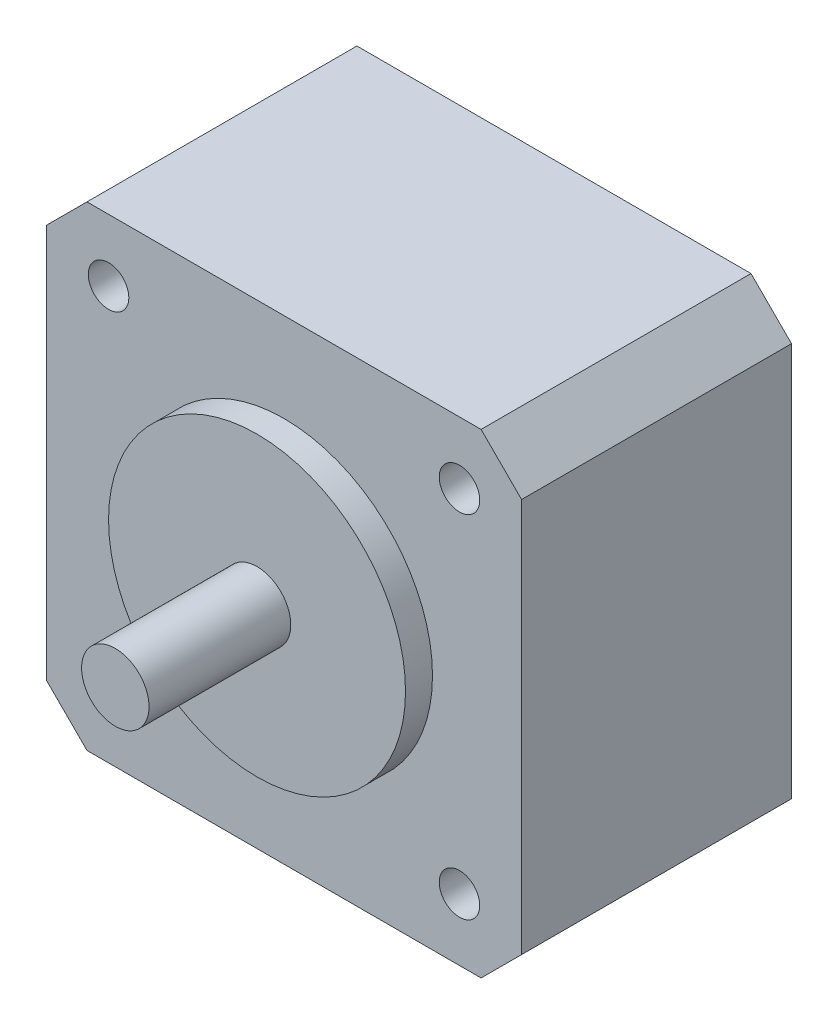
ISO-10303-21;
HEADER;
FILE_DESCRIPTION(('STEP AP214'),'2;1');
FILE_NAME('part.step','',(''),(''),'','','');
FILE_SCHEMA(('AUTOMOTIVE_DESIGN { 1 0 10303 214 1 1 1 1 }'));
ENDSEC;
DATA;
#1=APPLICATION_CONTEXT('core data for automotive mechanical design processes');
#2=APPLICATION_PROTOCOL_DEFINITION('international standard','automotive_design',2000,#1);
#3=PRODUCT_CONTEXT('',#1,'mechanical');
#4=PRODUCT('Part','Part','',(#3));
#5=PRODUCT_RELATED_PRODUCT_CATEGORY('part','',(#4));
#6=PRODUCT_DEFINITION_FORMATION('','',#4);
#7=PRODUCT_DEFINITION_CONTEXT('part definition',#1,'design');
#8=PRODUCT_DEFINITION('design','',#6,#7);
#9=PRODUCT_DEFINITION_SHAPE('','',#8);
#10=(LENGTH_UNIT() NAMED_UNIT(*) SI_UNIT(.MILLI.,.METRE.));
#11=(NAMED_UNIT(*) PLANE_ANGLE_UNIT() SI_UNIT($,.RADIAN.));
#12=(NAMED_UNIT(*) SI_UNIT($,.STERADIAN.) SOLID_ANGLE_UNIT());
#13=UNCERTAINTY_MEASURE_WITH_UNIT(LENGTH_MEASURE(1.E-05),#10,'distance_accuracy_value','');
#14=(GEOMETRIC_REPRESENTATION_CONTEXT(3) GLOBAL_UNCERTAINTY_ASSIGNED_CONTEXT((#13)) GLOBAL_UNIT_ASSIGNED_CONTEXT((#10,
#11,#12)) REPRESENTATION_CONTEXT('',''));
#15=CARTESIAN_POINT('',(0.,0.,0.));
#16=DIRECTION('',(0.,0.,1.));
#17=DIRECTION('',(1.,0.,0.));
#18=AXIS2_PLACEMENT_3D('',#15,#16,#17);
#19=CARTESIAN_POINT('',(17.6,17.6,20.));
#20=DIRECTION('',(-1.,0.,0.));
#21=DIRECTION('',(0.,0.,1.));
#22=AXIS2_PLACEMENT_3D('',#19,#20,#21);
#23=PLANE('',#22);
#24=DIRECTION('',(0.,1.,0.));
#25=VECTOR('',#24,1.);
#26=CARTESIAN_POINT('',(17.6,17.6,20.));
#27=LINE('',#26,#25);
#28=CARTESIAN_POINT('',(17.6,-14.6,20.));
#29=VERTEX_POINT('',#28);
#30=CARTESIAN_POINT('',(17.6,14.6,20.));
#31=VERTEX_POINT('',#30);
#32=EDGE_CURVE('E127',#29,#31,#27,.T.);
#33=ORIENTED_EDGE('',*,*,#32,.F.);
#34=DIRECTION('',(0.,0.,-1.));
#35=VECTOR('',#34,1.);
#36=CARTESIAN_POINT('',(17.6,-14.6,20.));
#37=LINE('',#36,#35);
#38=CARTESIAN_POINT('',(17.6,-14.6,0.));
#39=VERTEX_POINT('',#38);
#40=EDGE_CURVE('E11',#29,#39,#37,.T.);
#41=ORIENTED_EDGE('',*,*,#40,.T.);
#42=DIRECTION('',(0.,1.,0.));
#43=VECTOR('',#42,1.);
#44=CARTESIAN_POINT('',(17.6,17.6,0.));
#45=LINE('',#44,#43);
#46=CARTESIAN_POINT('',(17.6,14.6,0.));
#47=VERTEX_POINT('',#46);
#48=EDGE_CURVE('E159',#39,#47,#45,.T.);
#49=ORIENTED_EDGE('',*,*,#48,.T.);
#50=DIRECTION('',(0.,0.,1.));
#51=VECTOR('',#50,1.);
#52=CARTESIAN_POINT('',(17.6,14.6,20.));
#53=LINE('',#52,#51);
#54=EDGE_CURVE('E41',#47,#31,#53,.T.);
#55=ORIENTED_EDGE('',*,*,#54,.T.);
#56=EDGE_LOOP('',(#33,#41,#49,#55));
#57=FACE_BOUND('',#56,.T.);
#58=ADVANCED_FACE('F33',(#57),#23,.F.);
#59=CARTESIAN_POINT('',(-17.6,17.6,20.));
#60=DIRECTION('',(0.,-1.,0.));
#61=DIRECTION('',(0.,0.,-1.));
#62=AXIS2_PLACEMENT_3D('',#59,#60,#61);
#63=PLANE('',#62);
#64=DIRECTION('',(-1.,0.,0.));
#65=VECTOR('',#64,1.);
#66=CARTESIAN_POINT('',(-17.6,17.6,0.));
#67=LINE('',#66,#65);
#68=CARTESIAN_POINT('',(14.6,17.6,0.));
#69=VERTEX_POINT('',#68);
#70=CARTESIAN_POINT('',(-14.6,17.6,0.));
#71=VERTEX_POINT('',#70);
#72=EDGE_CURVE('E132',#69,#71,#67,.T.);
#73=ORIENTED_EDGE('',*,*,#72,.T.);
#74=DIRECTION('',(0.,0.,1.));
#75=VECTOR('',#74,1.);
#76=CARTESIAN_POINT('',(-14.6,17.6,20.));
#77=LINE('',#76,#75);
#78=CARTESIAN_POINT('',(-14.6,17.6,20.));
#79=VERTEX_POINT('',#78);
#80=EDGE_CURVE('E48',#71,#79,#77,.T.);
#81=ORIENTED_EDGE('',*,*,#80,.T.);
#82=DIRECTION('',(-1.,0.,0.));
#83=VECTOR('',#82,1.);
#84=CARTESIAN_POINT('',(-17.6,17.6,20.));
#85=LINE('',#84,#83);
#86=CARTESIAN_POINT('',(14.6,17.6,20.));
#87=VERTEX_POINT('',#86);
#88=EDGE_CURVE('E130',#87,#79,#85,.T.);
#89=ORIENTED_EDGE('',*,*,#88,.F.);
#90=DIRECTION('',(0.,0.,-1.));
#91=VECTOR('',#90,1.);
#92=CARTESIAN_POINT('',(14.6,17.6,20.));
#93=LINE('',#92,#91);
#94=EDGE_CURVE('E151',#87,#69,#93,.T.);
#95=ORIENTED_EDGE('',*,*,#94,.T.);
#96=EDGE_LOOP('',(#73,#81,#89,#95));
#97=FACE_BOUND('',#96,.T.);
#98=ADVANCED_FACE('F166',(#97),#63,.F.);
#99=CARTESIAN_POINT('',(-17.6,17.6,20.));
#100=DIRECTION('',(1.,0.,0.));
#101=DIRECTION('',(0.,1.,0.));
#102=AXIS2_PLACEMENT_3D('',#99,#100,#101);
#103=PLANE('',#102);
#104=DIRECTION('',(0.,-1.,0.));
#105=VECTOR('',#104,1.);
#106=CARTESIAN_POINT('',(-17.6,17.6,0.));
#107=LINE('',#106,#105);
#108=CARTESIAN_POINT('',(-17.6,14.6,0.));
#109=VERTEX_POINT('',#108);
#110=CARTESIAN_POINT('',(-17.6,-14.6,0.));
#111=VERTEX_POINT('',#110);
#112=EDGE_CURVE('E128',#109,#111,#107,.T.);
#113=ORIENTED_EDGE('',*,*,#112,.T.);
#114=DIRECTION('',(0.,0.,1.));
#115=VECTOR('',#114,1.);
#116=CARTESIAN_POINT('',(-17.6,-14.6,20.));
#117=LINE('',#116,#115);
#118=CARTESIAN_POINT('',(-17.6,-14.6,20.));
#119=VERTEX_POINT('',#118);
#120=EDGE_CURVE('E105',#111,#119,#117,.T.);
#121=ORIENTED_EDGE('',*,*,#120,.T.);
#122=DIRECTION('',(0.,-1.,0.));
#123=VECTOR('',#122,1.);
#124=CARTESIAN_POINT('',(-17.6,17.6,20.));
#125=LINE('',#124,#123);
#126=CARTESIAN_POINT('',(-17.6,14.6,20.));
#127=VERTEX_POINT('',#126);
#128=EDGE_CURVE('E172',#127,#119,#125,.T.);
#129=ORIENTED_EDGE('',*,*,#128,.F.);
#130=DIRECTION('',(0.,0.,-1.));
#131=VECTOR('',#130,1.);
#132=CARTESIAN_POINT('',(-17.6,14.6,20.));
#133=LINE('',#132,#131);
#134=EDGE_CURVE('E110',#127,#109,#133,.T.);
#135=ORIENTED_EDGE('',*,*,#134,.T.);
#136=EDGE_LOOP('',(#113,#121,#129,#135));
#137=FACE_BOUND('',#136,.T.);
#138=ADVANCED_FACE('F245',(#137),#103,.F.);
#139=CARTESIAN_POINT('',(-17.6,-17.6,20.));
#140=DIRECTION('',(0.,1.,0.));
#141=DIRECTION('',(0.,0.,1.));
#142=AXIS2_PLACEMENT_3D('',#139,#140,#141);
#143=PLANE('',#142);
#144=DIRECTION('',(1.,0.,0.));
#145=VECTOR('',#144,1.);
#146=CARTESIAN_POINT('',(-17.6,-17.6,20.));
#147=LINE('',#146,#145);
#148=CARTESIAN_POINT('',(-14.6,-17.6,20.));
#149=VERTEX_POINT('',#148);
#150=CARTESIAN_POINT('',(14.6,-17.6,20.));
#151=VERTEX_POINT('',#150);
#152=EDGE_CURVE('E120',#149,#151,#147,.T.);
#153=ORIENTED_EDGE('',*,*,#152,.F.);
#154=DIRECTION('',(0.,0.,-1.));
#155=VECTOR('',#154,1.);
#156=CARTESIAN_POINT('',(-14.6,-17.6,20.));
#157=LINE('',#156,#155);
#158=CARTESIAN_POINT('',(-14.6,-17.6,0.));
#159=VERTEX_POINT('',#158);
#160=EDGE_CURVE('E104',#149,#159,#157,.T.);
#161=ORIENTED_EDGE('',*,*,#160,.T.);
#162=DIRECTION('',(1.,0.,0.));
#163=VECTOR('',#162,1.);
#164=CARTESIAN_POINT('',(-17.6,-17.6,0.));
#165=LINE('',#164,#163);
#166=CARTESIAN_POINT('',(14.6,-17.6,0.));
#167=VERTEX_POINT('',#166);
#168=EDGE_CURVE('E117',#159,#167,#165,.T.);
#169=ORIENTED_EDGE('',*,*,#168,.T.);
#170=DIRECTION('',(0.,0.,1.));
#171=VECTOR('',#170,1.);
#172=CARTESIAN_POINT('',(14.6,-17.6,20.));
#173=LINE('',#172,#171);
#174=EDGE_CURVE('E122',#167,#151,#173,.T.);
#175=ORIENTED_EDGE('',*,*,#174,.T.);
#176=EDGE_LOOP('',(#153,#161,#169,#175));
#177=FACE_BOUND('',#176,.T.);
#178=ADVANCED_FACE('F116',(#177),#143,.F.);
#179=CARTESIAN_POINT('',(0.,0.,20.));
#180=DIRECTION('',(0.,0.,1.));
#181=DIRECTION('',(1.,0.,0.));
#182=AXIS2_PLACEMENT_3D('',#179,#180,#181);
#183=PLANE('',#182);
#184=CARTESIAN_POINT('',(-13.,13.,20.));
#185=DIRECTION('',(0.,0.,1.));
#186=DIRECTION('',(1.,0.,0.));
#187=AXIS2_PLACEMENT_3D('',#184,#185,#186);
#188=CIRCLE('',#187,1.5);
#189=CARTESIAN_POINT('',(-11.5,13.,20.));
#190=VERTEX_POINT('',#189);
#191=EDGE_CURVE('E191',#190,#190,#188,.T.);
#192=ORIENTED_EDGE('',*,*,#191,.F.);
#193=EDGE_LOOP('',(#192));
#194=FACE_BOUND('',#193,.T.);
#195=CARTESIAN_POINT('',(-13.,-13.,20.));
#196=DIRECTION('',(0.,0.,1.));
#197=DIRECTION('',(1.,0.,0.));
#198=AXIS2_PLACEMENT_3D('',#195,#196,#197);
#199=CIRCLE('',#198,1.5);
#200=CARTESIAN_POINT('',(-11.5,-13.,20.));
#201=VERTEX_POINT('',#200);
#202=EDGE_CURVE('E197',#201,#201,#199,.T.);
#203=ORIENTED_EDGE('',*,*,#202,.F.);
#204=EDGE_LOOP('',(#203));
#205=FACE_BOUND('',#204,.T.);
#206=CARTESIAN_POINT('',(13.,-13.,20.));
#207=DIRECTION('',(0.,0.,1.));
#208=DIRECTION('',(1.,0.,0.));
#209=AXIS2_PLACEMENT_3D('',#206,#207,#208);
#210=CIRCLE('',#209,1.5);
#211=CARTESIAN_POINT('',(14.5,-13.,20.));
#212=VERTEX_POINT('',#211);
#213=EDGE_CURVE('E203',#212,#212,#210,.T.);
#214=ORIENTED_EDGE('',*,*,#213,.F.);
#215=EDGE_LOOP('',(#214));
#216=FACE_BOUND('',#215,.T.);
#217=CARTESIAN_POINT('',(13.,13.,20.));
#218=DIRECTION('',(0.,0.,1.));
#219=DIRECTION('',(1.,0.,0.));
#220=AXIS2_PLACEMENT_3D('',#217,#218,#219);
#221=CIRCLE('',#220,1.5);
#222=CARTESIAN_POINT('',(14.5,13.,20.));
#223=VERTEX_POINT('',#222);
#224=EDGE_CURVE('E185',#223,#223,#221,.T.);
#225=ORIENTED_EDGE('',*,*,#224,.F.);
#226=EDGE_LOOP('',(#225));
#227=FACE_BOUND('',#226,.T.);
#228=CARTESIAN_POINT('',(0.,0.,20.));
#229=DIRECTION('',(0.,0.,1.));
#230=DIRECTION('',(1.,0.,0.));
#231=AXIS2_PLACEMENT_3D('',#228,#229,#230);
#232=CIRCLE('',#231,11.);
#233=CARTESIAN_POINT('',(11.,0.,20.));
#234=VERTEX_POINT('',#233);
#235=EDGE_CURVE('E171',#234,#234,#232,.T.);
#236=ORIENTED_EDGE('',*,*,#235,.F.);
#237=EDGE_LOOP('',(#236));
#238=FACE_BOUND('',#237,.T.);
#239=ORIENTED_EDGE('',*,*,#128,.T.);
#240=DIRECTION('',(-0.707106781186546,0.707106781186549,0.));
#241=VECTOR('',#240,1.);
#242=CARTESIAN_POINT('',(-16.1,-16.1,20.));
#243=LINE('',#242,#241);
#244=EDGE_CURVE('E149',#119,#149,#243,.F.);
#245=ORIENTED_EDGE('',*,*,#244,.T.);
#246=ORIENTED_EDGE('',*,*,#152,.T.);
#247=DIRECTION('',(-0.707106781186549,-0.707106781186546,0.));
#248=VECTOR('',#247,1.);
#249=CARTESIAN_POINT('',(16.1,-16.1,20.));
#250=LINE('',#249,#248);
#251=EDGE_CURVE('E145',#151,#29,#250,.F.);
#252=ORIENTED_EDGE('',*,*,#251,.T.);
#253=ORIENTED_EDGE('',*,*,#32,.T.);
#254=DIRECTION('',(0.707106781186546,-0.707106781186549,0.));
#255=VECTOR('',#254,1.);
#256=CARTESIAN_POINT('',(16.1,16.1,20.));
#257=LINE('',#256,#255);
#258=EDGE_CURVE('E55',#31,#87,#257,.F.);
#259=ORIENTED_EDGE('',*,*,#258,.T.);
#260=ORIENTED_EDGE('',*,*,#88,.T.);
#261=DIRECTION('',(0.707106781186549,0.707106781186546,0.));
#262=VECTOR('',#261,1.);
#263=CARTESIAN_POINT('',(-16.1,16.1,20.));
#264=LINE('',#263,#262);
#265=EDGE_CURVE('E147',#79,#127,#264,.F.);
#266=ORIENTED_EDGE('',*,*,#265,.T.);
#267=EDGE_LOOP('',(#239,#245,#246,#252,#253,#259,#260,#266));
#268=FACE_BOUND('',#267,.T.);
#269=ADVANCED_FACE('F162',(#194,#205,#216,#227,#238,#268),#183,.T.);
#270=CARTESIAN_POINT('',(0.,0.,0.));
#271=DIRECTION('',(0.,0.,1.));
#272=DIRECTION('',(1.,0.,0.));
#273=AXIS2_PLACEMENT_3D('',#270,#271,#272);
#274=PLANE('',#273);
#275=ORIENTED_EDGE('',*,*,#168,.F.);
#276=DIRECTION('',(0.707106781186546,-0.707106781186549,0.));
#277=VECTOR('',#276,1.);
#278=CARTESIAN_POINT('',(-14.6,-17.6,0.));
#279=LINE('',#278,#277);
#280=EDGE_CURVE('E100',#159,#111,#279,.F.);
#281=ORIENTED_EDGE('',*,*,#280,.T.);
#282=ORIENTED_EDGE('',*,*,#112,.F.);
#283=DIRECTION('',(-0.707106781186549,-0.707106781186546,0.));
#284=VECTOR('',#283,1.);
#285=CARTESIAN_POINT('',(-17.6,14.6,0.));
#286=LINE('',#285,#284);
#287=EDGE_CURVE('E111',#109,#71,#286,.F.);
#288=ORIENTED_EDGE('',*,*,#287,.T.);
#289=ORIENTED_EDGE('',*,*,#72,.F.);
#290=DIRECTION('',(-0.707106781186546,0.707106781186549,0.));
#291=VECTOR('',#290,1.);
#292=CARTESIAN_POINT('',(14.6,17.6,0.));
#293=LINE('',#292,#291);
#294=EDGE_CURVE('E121',#69,#47,#293,.F.);
#295=ORIENTED_EDGE('',*,*,#294,.T.);
#296=ORIENTED_EDGE('',*,*,#48,.F.);
#297=DIRECTION('',(0.707106781186549,0.707106781186546,0.));
#298=VECTOR('',#297,1.);
#299=CARTESIAN_POINT('',(17.6,-14.6,0.));
#300=LINE('',#299,#298);
#301=EDGE_CURVE('E126',#39,#167,#300,.F.);
#302=ORIENTED_EDGE('',*,*,#301,.T.);
#303=EDGE_LOOP('',(#275,#281,#282,#288,#289,#295,#296,#302));
#304=FACE_BOUND('',#303,.T.);
#305=ADVANCED_FACE('F124',(#304),#274,.F.);
#306=CARTESIAN_POINT('',(0.,0.,22.));
#307=DIRECTION('',(0.,0.,-1.));
#308=DIRECTION('',(-1.,0.,0.));
#309=AXIS2_PLACEMENT_3D('',#306,#307,#308);
#310=CYLINDRICAL_SURFACE('',#309,11.);
#311=CARTESIAN_POINT('',(0.,0.,22.));
#312=DIRECTION('',(0.,0.,1.));
#313=DIRECTION('',(1.,0.,0.));
#314=AXIS2_PLACEMENT_3D('',#311,#312,#313);
#315=CIRCLE('',#314,11.);
#316=CARTESIAN_POINT('',(11.,0.,22.));
#317=VERTEX_POINT('',#316);
#318=EDGE_CURVE('E167',#317,#317,#315,.T.);
#319=ORIENTED_EDGE('',*,*,#318,.F.);
#320=EDGE_LOOP('',(#319));
#321=FACE_BOUND('',#320,.T.);
#322=ORIENTED_EDGE('',*,*,#235,.T.);
#323=EDGE_LOOP('',(#322));
#324=FACE_BOUND('',#323,.T.);
#325=ADVANCED_FACE('F226',(#321,#324),#310,.T.);
#326=CARTESIAN_POINT('',(0.,0.,22.));
#327=DIRECTION('',(0.,0.,1.));
#328=DIRECTION('',(1.,0.,0.));
#329=AXIS2_PLACEMENT_3D('',#326,#327,#328);
#330=PLANE('',#329);
#331=CARTESIAN_POINT('',(0.,0.,22.));
#332=DIRECTION('',(0.,0.,1.));
#333=DIRECTION('',(1.,0.,0.));
#334=AXIS2_PLACEMENT_3D('',#331,#332,#333);
#335=CIRCLE('',#334,2.5);
#336=CARTESIAN_POINT('',(-2.5,0.,22.));
#337=VERTEX_POINT('',#336);
#338=EDGE_CURVE('E136',#337,#337,#335,.T.);
#339=ORIENTED_EDGE('',*,*,#338,.F.);
#340=EDGE_LOOP('',(#339));
#341=FACE_BOUND('',#340,.T.);
#342=ORIENTED_EDGE('',*,*,#318,.T.);
#343=EDGE_LOOP('',(#342));
#344=FACE_BOUND('',#343,.T.);
#345=ADVANCED_FACE('F228',(#341,#344),#330,.T.);
#346=CARTESIAN_POINT('',(0.,0.,32.5));
#347=DIRECTION('',(0.,0.,-1.));
#348=DIRECTION('',(-1.,0.,0.));
#349=AXIS2_PLACEMENT_3D('',#346,#347,#348);
#350=CYLINDRICAL_SURFACE('',#349,2.5);
#351=CARTESIAN_POINT('',(0.,0.,32.5));
#352=DIRECTION('',(0.,0.,1.));
#353=DIRECTION('',(1.,0.,0.));
#354=AXIS2_PLACEMENT_3D('',#351,#352,#353);
#355=CIRCLE('',#354,2.5);
#356=CARTESIAN_POINT('',(-2.5,0.,32.5));
#357=VERTEX_POINT('',#356);
#358=EDGE_CURVE('E179',#357,#357,#355,.T.);
#359=CARTESIAN_POINT('',(-2.5,0.,32.5));
#360=CARTESIAN_POINT('',(-2.5,0.,32.390625));
#361=CARTESIAN_POINT('',(-2.5,0.,32.28125));
#362=CARTESIAN_POINT('',(-2.5,0.,32.0625));
#363=CARTESIAN_POINT('',(-2.5,0.,31.953125));
#364=CARTESIAN_POINT('',(-2.5,0.,31.734375));
#365=CARTESIAN_POINT('',(-2.5,0.,31.625));
#366=CARTESIAN_POINT('',(-2.5,0.,31.40625));
#367=CARTESIAN_POINT('',(-2.5,0.,31.296875));
#368=CARTESIAN_POINT('',(-2.5,0.,31.078125));
#369=CARTESIAN_POINT('',(-2.5,0.,30.96875));
#370=CARTESIAN_POINT('',(-2.5,0.,30.75));
#371=CARTESIAN_POINT('',(-2.5,0.,30.640625));
#372=CARTESIAN_POINT('',(-2.5,0.,30.421875));
#373=CARTESIAN_POINT('',(-2.5,0.,30.3125));
#374=CARTESIAN_POINT('',(-2.5,0.,30.09375));
#375=CARTESIAN_POINT('',(-2.5,0.,29.984375));
#376=CARTESIAN_POINT('',(-2.5,0.,29.765625));
#377=CARTESIAN_POINT('',(-2.5,0.,29.65625));
#378=CARTESIAN_POINT('',(-2.5,0.,29.4375));
#379=CARTESIAN_POINT('',(-2.5,0.,29.328125));
#380=CARTESIAN_POINT('',(-2.5,0.,29.109375));
#381=CARTESIAN_POINT('',(-2.5,0.,29.));
#382=CARTESIAN_POINT('',(-2.5,0.,28.78125));
#383=CARTESIAN_POINT('',(-2.5,0.,28.671875));
#384=CARTESIAN_POINT('',(-2.5,0.,28.453125));
#385=CARTESIAN_POINT('',(-2.5,0.,28.34375));
#386=CARTESIAN_POINT('',(-2.5,0.,28.125));
#387=CARTESIAN_POINT('',(-2.5,0.,28.015625));
#388=CARTESIAN_POINT('',(-2.5,0.,27.796875));
#389=CARTESIAN_POINT('',(-2.5,0.,27.6875));
#390=CARTESIAN_POINT('',(-2.5,0.,27.46875));
#391=CARTESIAN_POINT('',(-2.5,0.,27.359375));
#392=CARTESIAN_POINT('',(-2.5,0.,27.140625));
#393=CARTESIAN_POINT('',(-2.5,0.,27.03125));
#394=CARTESIAN_POINT('',(-2.5,0.,26.8125));
#395=CARTESIAN_POINT('',(-2.5,0.,26.703125));
#396=CARTESIAN_POINT('',(-2.5,0.,26.484375));
#397=CARTESIAN_POINT('',(-2.5,0.,26.375));
#398=CARTESIAN_POINT('',(-2.5,0.,26.15625));
#399=CARTESIAN_POINT('',(-2.5,0.,26.046875));
#400=CARTESIAN_POINT('',(-2.5,0.,25.828125));
#401=CARTESIAN_POINT('',(-2.5,0.,25.71875));
#402=CARTESIAN_POINT('',(-2.5,0.,25.5));
#403=CARTESIAN_POINT('',(-2.5,0.,25.390625));
#404=CARTESIAN_POINT('',(-2.5,0.,25.171875));
#405=CARTESIAN_POINT('',(-2.5,0.,25.0625));
#406=CARTESIAN_POINT('',(-2.5,0.,24.84375));
#407=CARTESIAN_POINT('',(-2.5,0.,24.734375));
#408=CARTESIAN_POINT('',(-2.5,0.,24.515625));
#409=CARTESIAN_POINT('',(-2.5,0.,24.40625));
#410=CARTESIAN_POINT('',(-2.5,0.,24.1875));
#411=CARTESIAN_POINT('',(-2.5,0.,24.078125));
#412=CARTESIAN_POINT('',(-2.5,0.,23.859375));
#413=CARTESIAN_POINT('',(-2.5,0.,23.75));
#414=CARTESIAN_POINT('',(-2.5,0.,23.53125));
#415=CARTESIAN_POINT('',(-2.5,0.,23.421875));
#416=CARTESIAN_POINT('',(-2.5,0.,23.203125));
#417=CARTESIAN_POINT('',(-2.5,0.,23.09375));
#418=CARTESIAN_POINT('',(-2.5,0.,22.875));
#419=CARTESIAN_POINT('',(-2.5,0.,22.765625));
#420=CARTESIAN_POINT('',(-2.5,0.,22.546875));
#421=CARTESIAN_POINT('',(-2.5,0.,22.4375));
#422=CARTESIAN_POINT('',(-2.5,0.,22.21875));
#423=CARTESIAN_POINT('',(-2.5,0.,22.109375));
#424=CARTESIAN_POINT('',(-2.5,0.,22.));
#425=B_SPLINE_CURVE_WITH_KNOTS('',3,(#359,#360,#361,#362,#363,#364,#365,#366,#367,#368,#369,
#370,#371,#372,#373,#374,#375,#376,#377,#378,#379,#380,#381,#382,#383,#384,#385,#386,#387,#388,
#389,#390,#391,#392,#393,#394,#395,#396,#397,#398,#399,#400,#401,#402,#403,#404,#405,#406,#407,
#408,#409,#410,#411,#412,#413,#414,#415,#416,#417,#418,#419,#420,#421,#422,#423,#424),
.UNSPECIFIED.,.F.,.F.,(4,2,2,2,2,2,2,2,2,2,2,2,2,2,2,2,2,2,2,2,2,2,2,2,2,2,2,2,2,2,2,2,4),(0.,
0.328125000000005,0.656250000000004,0.984375000000003,1.3125,1.640625,1.96875000000001,2.296875,
2.625,2.953125,3.28125,3.609375,3.9375,4.265625,4.59375,4.921875,5.25,5.578125,5.90625000000001,
6.234375,6.56250000000001,6.890625,7.21875,7.54687500000001,7.875,8.20312500000001,8.53125,
8.859375,9.1875,9.515625,9.84375000000001,10.171875,10.5),.UNSPECIFIED.);
#426=EDGE_CURVE('BSEAM235',#357,#337,#425,.T.);
#427=ORIENTED_EDGE('',*,*,#358,.F.);
#428=ORIENTED_EDGE('',*,*,#338,.T.);
#429=ORIENTED_EDGE('',*,*,#426,.T.);
#430=ORIENTED_EDGE('',*,*,#426,.F.);
#431=EDGE_LOOP('',(#427,#429,#428,#430));
#432=FACE_BOUND('',#431,.T.);
#433=ADVANCED_FACE('F235',(#432),#350,.T.);
#434=CARTESIAN_POINT('',(0.,0.,32.5));
#435=DIRECTION('',(0.,0.,1.));
#436=DIRECTION('',(1.,0.,0.));
#437=AXIS2_PLACEMENT_3D('',#434,#435,#436);
#438=PLANE('',#437);
#439=ORIENTED_EDGE('',*,*,#358,.T.);
#440=EDGE_LOOP('',(#439));
#441=FACE_BOUND('',#440,.T.);
#442=ADVANCED_FACE('F360',(#441),#438,.T.);
#443=CARTESIAN_POINT('',(13.,13.,15.5));
#444=DIRECTION('',(0.,0.,1.));
#445=DIRECTION('',(1.,0.,0.));
#446=AXIS2_PLACEMENT_3D('',#443,#444,#445);
#447=CYLINDRICAL_SURFACE('',#446,1.5);
#448=CARTESIAN_POINT('',(13.,13.,15.5));
#449=DIRECTION('',(0.,0.,1.));
#450=DIRECTION('',(1.,0.,0.));
#451=AXIS2_PLACEMENT_3D('',#448,#449,#450);
#452=CIRCLE('',#451,1.5);
#453=CARTESIAN_POINT('',(14.5,13.,15.5));
#454=VERTEX_POINT('',#453);
#455=EDGE_CURVE('E184',#454,#454,#452,.T.);
#456=ORIENTED_EDGE('',*,*,#455,.F.);
#457=EDGE_LOOP('',(#456));
#458=FACE_BOUND('',#457,.T.);
#459=ORIENTED_EDGE('',*,*,#224,.T.);
#460=EDGE_LOOP('',(#459));
#461=FACE_BOUND('',#460,.T.);
#462=ADVANCED_FACE('F352',(#458,#461),#447,.F.);
#463=CARTESIAN_POINT('',(13.,13.,15.5));
#464=DIRECTION('',(0.,0.,1.));
#465=DIRECTION('',(1.,0.,0.));
#466=AXIS2_PLACEMENT_3D('',#463,#464,#465);
#467=PLANE('',#466);
#468=ORIENTED_EDGE('',*,*,#455,.T.);
#469=EDGE_LOOP('',(#468));
#470=FACE_BOUND('',#469,.T.);
#471=ADVANCED_FACE('F214',(#470),#467,.T.);
#472=CARTESIAN_POINT('',(13.,-13.,15.5));
#473=DIRECTION('',(0.,0.,1.));
#474=DIRECTION('',(1.,0.,0.));
#475=AXIS2_PLACEMENT_3D('',#472,#473,#474);
#476=CYLINDRICAL_SURFACE('',#475,1.5);
#477=CARTESIAN_POINT('',(13.,-13.,15.5));
#478=DIRECTION('',(0.,0.,1.));
#479=DIRECTION('',(1.,0.,0.));
#480=AXIS2_PLACEMENT_3D('',#477,#478,#479);
#481=CIRCLE('',#480,1.5);
#482=CARTESIAN_POINT('',(14.5,-13.,15.5));
#483=VERTEX_POINT('',#482);
#484=EDGE_CURVE('E188',#483,#483,#481,.T.);
#485=ORIENTED_EDGE('',*,*,#484,.F.);
#486=EDGE_LOOP('',(#485));
#487=FACE_BOUND('',#486,.T.);
#488=ORIENTED_EDGE('',*,*,#213,.T.);
#489=EDGE_LOOP('',(#488));
#490=FACE_BOUND('',#489,.T.);
#491=ADVANCED_FACE('F211',(#487,#490),#476,.F.);
#492=CARTESIAN_POINT('',(13.,-13.,15.5));
#493=DIRECTION('',(0.,0.,1.));
#494=DIRECTION('',(1.,0.,0.));
#495=AXIS2_PLACEMENT_3D('',#492,#493,#494);
#496=PLANE('',#495);
#497=ORIENTED_EDGE('',*,*,#484,.T.);
#498=EDGE_LOOP('',(#497));
#499=FACE_BOUND('',#498,.T.);
#500=ADVANCED_FACE('F209',(#499),#496,.T.);
#501=CARTESIAN_POINT('',(-13.,-13.,15.5));
#502=DIRECTION('',(0.,0.,1.));
#503=DIRECTION('',(1.,0.,0.));
#504=AXIS2_PLACEMENT_3D('',#501,#502,#503);
#505=CYLINDRICAL_SURFACE('',#504,1.5);
#506=CARTESIAN_POINT('',(-13.,-13.,15.5));
#507=DIRECTION('',(0.,0.,1.));
#508=DIRECTION('',(1.,0.,0.));
#509=AXIS2_PLACEMENT_3D('',#506,#507,#508);
#510=CIRCLE('',#509,1.5);
#511=CARTESIAN_POINT('',(-11.5,-13.,15.5));
#512=VERTEX_POINT('',#511);
#513=EDGE_CURVE('E200',#512,#512,#510,.T.);
#514=ORIENTED_EDGE('',*,*,#513,.F.);
#515=EDGE_LOOP('',(#514));
#516=FACE_BOUND('',#515,.T.);
#517=ORIENTED_EDGE('',*,*,#202,.T.);
#518=EDGE_LOOP('',(#517));
#519=FACE_BOUND('',#518,.T.);
#520=ADVANCED_FACE('F327',(#516,#519),#505,.F.);
#521=CARTESIAN_POINT('',(-13.,-13.,15.5));
#522=DIRECTION('',(0.,0.,1.));
#523=DIRECTION('',(1.,0.,0.));
#524=AXIS2_PLACEMENT_3D('',#521,#522,#523);
#525=PLANE('',#524);
#526=ORIENTED_EDGE('',*,*,#513,.T.);
#527=EDGE_LOOP('',(#526));
#528=FACE_BOUND('',#527,.T.);
#529=ADVANCED_FACE('F319',(#528),#525,.T.);
#530=CARTESIAN_POINT('',(-13.,13.,15.5));
#531=DIRECTION('',(0.,0.,1.));
#532=DIRECTION('',(1.,0.,0.));
#533=AXIS2_PLACEMENT_3D('',#530,#531,#532);
#534=CYLINDRICAL_SURFACE('',#533,1.5);
#535=CARTESIAN_POINT('',(-13.,13.,15.5));
#536=DIRECTION('',(0.,0.,1.));
#537=DIRECTION('',(1.,0.,0.));
#538=AXIS2_PLACEMENT_3D('',#535,#536,#537);
#539=CIRCLE('',#538,1.5);
#540=CARTESIAN_POINT('',(-11.5,13.,15.5));
#541=VERTEX_POINT('',#540);
#542=EDGE_CURVE('E194',#541,#541,#539,.T.);
#543=ORIENTED_EDGE('',*,*,#542,.F.);
#544=EDGE_LOOP('',(#543));
#545=FACE_BOUND('',#544,.T.);
#546=ORIENTED_EDGE('',*,*,#191,.T.);
#547=EDGE_LOOP('',(#546));
#548=FACE_BOUND('',#547,.T.);
#549=ADVANCED_FACE('F312',(#545,#548),#534,.F.);
#550=CARTESIAN_POINT('',(-13.,13.,15.5));
#551=DIRECTION('',(0.,0.,1.));
#552=DIRECTION('',(1.,0.,0.));
#553=AXIS2_PLACEMENT_3D('',#550,#551,#552);
#554=PLANE('',#553);
#555=ORIENTED_EDGE('',*,*,#542,.T.);
#556=EDGE_LOOP('',(#555));
#557=FACE_BOUND('',#556,.T.);
#558=ADVANCED_FACE('F252',(#557),#554,.T.);
#559=CARTESIAN_POINT('',(-14.6,-17.6,20.));
#560=DIRECTION('',(0.707106781186549,0.707106781186546,0.));
#561=DIRECTION('',(0.,0.,-1.));
#562=AXIS2_PLACEMENT_3D('',#559,#560,#561);
#563=PLANE('',#562);
#564=ORIENTED_EDGE('',*,*,#244,.F.);
#565=ORIENTED_EDGE('',*,*,#120,.F.);
#566=ORIENTED_EDGE('',*,*,#280,.F.);
#567=ORIENTED_EDGE('',*,*,#160,.F.);
#568=EDGE_LOOP('',(#564,#565,#566,#567));
#569=FACE_BOUND('',#568,.T.);
#570=ADVANCED_FACE('F103',(#569),#563,.F.);
#571=CARTESIAN_POINT('',(-17.6,14.6,20.));
#572=DIRECTION('',(0.707106781186546,-0.707106781186549,0.));
#573=DIRECTION('',(0.,0.,-1.));
#574=AXIS2_PLACEMENT_3D('',#571,#572,#573);
#575=PLANE('',#574);
#576=ORIENTED_EDGE('',*,*,#265,.F.);
#577=ORIENTED_EDGE('',*,*,#80,.F.);
#578=ORIENTED_EDGE('',*,*,#287,.F.);
#579=ORIENTED_EDGE('',*,*,#134,.F.);
#580=EDGE_LOOP('',(#576,#577,#578,#579));
#581=FACE_BOUND('',#580,.T.);
#582=ADVANCED_FACE('F251',(#581),#575,.F.);
#583=CARTESIAN_POINT('',(17.6,-14.6,20.));
#584=DIRECTION('',(-0.707106781186546,0.707106781186549,0.));
#585=DIRECTION('',(0.,0.,-1.));
#586=AXIS2_PLACEMENT_3D('',#583,#584,#585);
#587=PLANE('',#586);
#588=ORIENTED_EDGE('',*,*,#251,.F.);
#589=ORIENTED_EDGE('',*,*,#174,.F.);
#590=ORIENTED_EDGE('',*,*,#301,.F.);
#591=ORIENTED_EDGE('',*,*,#40,.F.);
#592=EDGE_LOOP('',(#588,#589,#590,#591));
#593=FACE_BOUND('',#592,.T.);
#594=ADVANCED_FACE('F254',(#593),#587,.F.);
#595=CARTESIAN_POINT('',(14.6,17.6,20.));
#596=DIRECTION('',(-0.707106781186549,-0.707106781186546,0.));
#597=DIRECTION('',(0.,0.,-1.));
#598=AXIS2_PLACEMENT_3D('',#595,#596,#597);
#599=PLANE('',#598);
#600=ORIENTED_EDGE('',*,*,#258,.F.);
#601=ORIENTED_EDGE('',*,*,#54,.F.);
#602=ORIENTED_EDGE('',*,*,#294,.F.);
#603=ORIENTED_EDGE('',*,*,#94,.F.);
#604=EDGE_LOOP('',(#600,#601,#602,#603));
#605=FACE_BOUND('',#604,.T.);
#606=ADVANCED_FACE('F35',(#605),#599,.F.);
#607=CLOSED_SHELL('',(#58,#98,#138,#178,#269,#305,#325,#345,#433,#442,#462,#471,#491,#500,#520,
#529,#549,#558,#570,#582,#594,#606));
#608=MANIFOLD_SOLID_BREP('B2',#607);
#609=ADVANCED_BREP_SHAPE_REPRESENTATION('',(#18,#608),#14);
#610=SHAPE_DEFINITION_REPRESENTATION(#9,#609);
ENDSEC;
END-ISO-10303-21;
